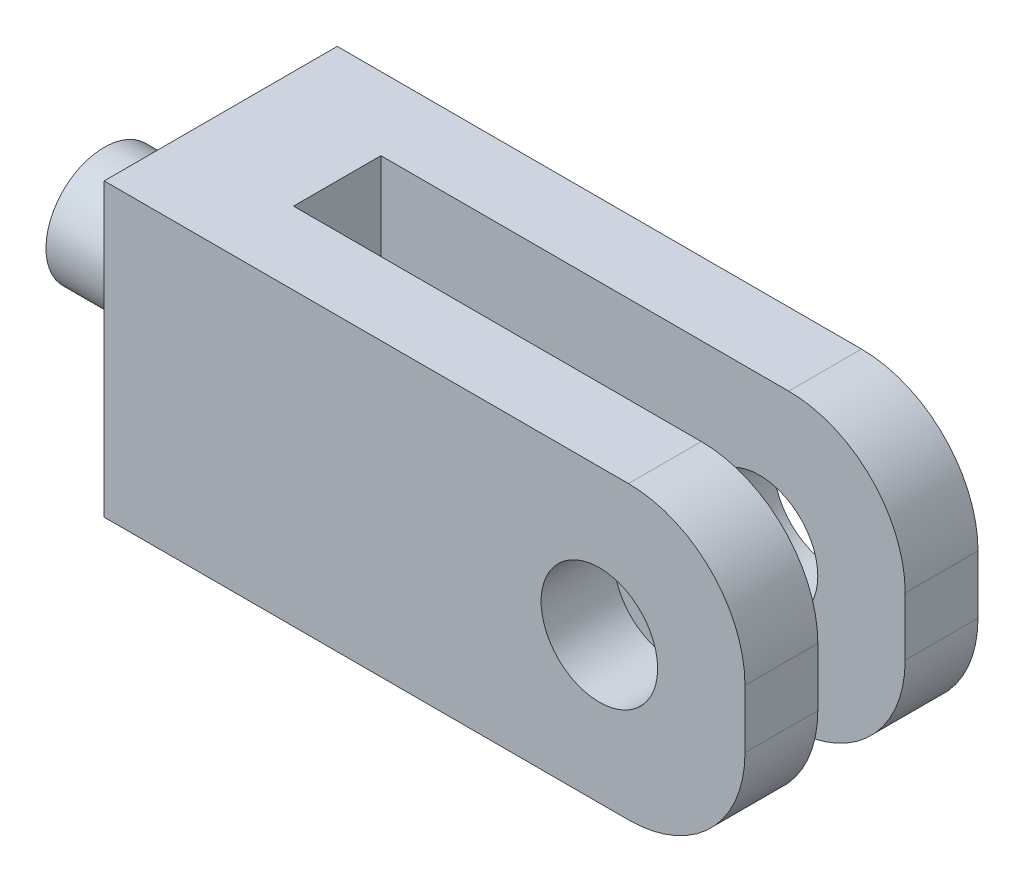
ISO-10303-21;
HEADER;
FILE_DESCRIPTION(('STEP AP214'),'2;1');
FILE_NAME('part.step','',(''),(''),'','','');
FILE_SCHEMA(('AUTOMOTIVE_DESIGN { 1 0 10303 214 1 1 1 1 }'));
ENDSEC;
DATA;
#1=APPLICATION_CONTEXT('core data for automotive mechanical design processes');
#2=APPLICATION_PROTOCOL_DEFINITION('international standard','automotive_design',2000,#1);
#3=PRODUCT_CONTEXT('',#1,'mechanical');
#4=PRODUCT('Part','Part','',(#3));
#5=PRODUCT_RELATED_PRODUCT_CATEGORY('part','',(#4));
#6=PRODUCT_DEFINITION_FORMATION('','',#4);
#7=PRODUCT_DEFINITION_CONTEXT('part definition',#1,'design');
#8=PRODUCT_DEFINITION('design','',#6,#7);
#9=PRODUCT_DEFINITION_SHAPE('','',#8);
#10=(LENGTH_UNIT() NAMED_UNIT(*) SI_UNIT(.MILLI.,.METRE.));
#11=(NAMED_UNIT(*) PLANE_ANGLE_UNIT() SI_UNIT($,.RADIAN.));
#12=(NAMED_UNIT(*) SI_UNIT($,.STERADIAN.) SOLID_ANGLE_UNIT());
#13=UNCERTAINTY_MEASURE_WITH_UNIT(LENGTH_MEASURE(1.E-05),#10,'distance_accuracy_value','');
#14=(GEOMETRIC_REPRESENTATION_CONTEXT(3) GLOBAL_UNCERTAINTY_ASSIGNED_CONTEXT((#13)) GLOBAL_UNIT_ASSIGNED_CONTEXT((#10,
#11,#12)) REPRESENTATION_CONTEXT('',''));
#15=CARTESIAN_POINT('',(0.,0.,0.));
#16=DIRECTION('',(0.,0.,1.));
#17=DIRECTION('',(1.,0.,0.));
#18=AXIS2_PLACEMENT_3D('',#15,#16,#17);
#19=CARTESIAN_POINT('',(55.,25.,40.));
#20=DIRECTION('',(-1.,0.,0.));
#21=DIRECTION('',(0.,0.,1.));
#22=AXIS2_PLACEMENT_3D('',#19,#20,#21);
#23=PLANE('',#22);
#24=DIRECTION('',(0.,1.,0.));
#25=VECTOR('',#24,1.);
#26=CARTESIAN_POINT('',(55.,25.,40.));
#27=LINE('',#26,#25);
#28=CARTESIAN_POINT('',(55.,-5.,40.));
#29=VERTEX_POINT('',#28);
#30=CARTESIAN_POINT('',(55.,5.,40.));
#31=VERTEX_POINT('',#30);
#32=EDGE_CURVE('E156',#29,#31,#27,.T.);
#33=ORIENTED_EDGE('',*,*,#32,.F.);
#34=DIRECTION('',(0.,0.,-1.));
#35=VECTOR('',#34,1.);
#36=CARTESIAN_POINT('',(55.,-5.,40.));
#37=LINE('',#36,#35);
#38=CARTESIAN_POINT('',(55.,-5.,27.5));
#39=VERTEX_POINT('',#38);
#40=EDGE_CURVE('E202',#29,#39,#37,.T.);
#41=ORIENTED_EDGE('',*,*,#40,.T.);
#42=DIRECTION('',(0.,-1.,0.));
#43=VECTOR('',#42,1.);
#44=CARTESIAN_POINT('',(55.,-25.,27.5));
#45=LINE('',#44,#43);
#46=CARTESIAN_POINT('',(55.,5.,27.5));
#47=VERTEX_POINT('',#46);
#48=EDGE_CURVE('E224',#47,#39,#45,.T.);
#49=ORIENTED_EDGE('',*,*,#48,.F.);
#50=DIRECTION('',(0.,0.,-1.));
#51=VECTOR('',#50,1.);
#52=CARTESIAN_POINT('',(55.,5.,40.));
#53=LINE('',#52,#51);
#54=EDGE_CURVE('E49',#47,#31,#53,.F.);
#55=ORIENTED_EDGE('',*,*,#54,.T.);
#56=EDGE_LOOP('',(#33,#41,#49,#55));
#57=FACE_BOUND('',#56,.T.);
#58=ADVANCED_FACE('F32',(#57),#23,.F.);
#59=DIRECTION('',(0.,1.,0.));
#60=VECTOR('',#59,1.);
#61=CARTESIAN_POINT('',(55.,-25.,12.5));
#62=LINE('',#61,#60);
#63=CARTESIAN_POINT('',(55.,-5.,12.5));
#64=VERTEX_POINT('',#63);
#65=CARTESIAN_POINT('',(55.,5.,12.5));
#66=VERTEX_POINT('',#65);
#67=EDGE_CURVE('E226',#64,#66,#62,.T.);
#68=ORIENTED_EDGE('',*,*,#67,.F.);
#69=DIRECTION('',(0.,0.,-1.));
#70=VECTOR('',#69,1.);
#71=CARTESIAN_POINT('',(55.,-5.,40.));
#72=LINE('',#71,#70);
#73=CARTESIAN_POINT('',(55.,-5.,0.));
#74=VERTEX_POINT('',#73);
#75=EDGE_CURVE('E181',#64,#74,#72,.T.);
#76=ORIENTED_EDGE('',*,*,#75,.T.);
#77=DIRECTION('',(0.,1.,0.));
#78=VECTOR('',#77,1.);
#79=CARTESIAN_POINT('',(55.,25.,0.));
#80=LINE('',#79,#78);
#81=CARTESIAN_POINT('',(55.,5.,0.));
#82=VERTEX_POINT('',#81);
#83=EDGE_CURVE('E166',#74,#82,#80,.T.);
#84=ORIENTED_EDGE('',*,*,#83,.T.);
#85=DIRECTION('',(0.,0.,-1.));
#86=VECTOR('',#85,1.);
#87=CARTESIAN_POINT('',(55.,5.,40.));
#88=LINE('',#87,#86);
#89=EDGE_CURVE('E179',#82,#66,#88,.F.);
#90=ORIENTED_EDGE('',*,*,#89,.T.);
#91=EDGE_LOOP('',(#68,#76,#84,#90));
#92=FACE_BOUND('',#91,.T.);
#93=ADVANCED_FACE('F272',(#92),#23,.F.);
#94=CARTESIAN_POINT('',(-55.,25.,40.));
#95=DIRECTION('',(0.,-1.,0.));
#96=DIRECTION('',(0.,0.,-1.));
#97=AXIS2_PLACEMENT_3D('',#94,#95,#96);
#98=PLANE('',#97);
#99=DIRECTION('',(1.,0.,0.));
#100=VECTOR('',#99,1.);
#101=CARTESIAN_POINT('',(-35.,25.,12.5));
#102=LINE('',#101,#100);
#103=CARTESIAN_POINT('',(-35.,25.,12.5));
#104=VERTEX_POINT('',#103);
#105=CARTESIAN_POINT('',(35.,25.,12.5));
#106=VERTEX_POINT('',#105);
#107=EDGE_CURVE('E131',#104,#106,#102,.T.);
#108=ORIENTED_EDGE('',*,*,#107,.T.);
#109=DIRECTION('',(0.,0.,-1.));
#110=VECTOR('',#109,1.);
#111=CARTESIAN_POINT('',(35.,25.,40.));
#112=LINE('',#111,#110);
#113=CARTESIAN_POINT('',(35.,25.,0.));
#114=VERTEX_POINT('',#113);
#115=EDGE_CURVE('E198',#106,#114,#112,.T.);
#116=ORIENTED_EDGE('',*,*,#115,.T.);
#117=DIRECTION('',(-1.,0.,0.));
#118=VECTOR('',#117,1.);
#119=CARTESIAN_POINT('',(-55.,25.,0.));
#120=LINE('',#119,#118);
#121=CARTESIAN_POINT('',(-55.,25.,0.));
#122=VERTEX_POINT('',#121);
#123=EDGE_CURVE('E169',#114,#122,#120,.T.);
#124=ORIENTED_EDGE('',*,*,#123,.T.);
#125=DIRECTION('',(0.,0.,-1.));
#126=VECTOR('',#125,1.);
#127=CARTESIAN_POINT('',(-55.,25.,40.));
#128=LINE('',#127,#126);
#129=CARTESIAN_POINT('',(-55.,25.,40.));
#130=VERTEX_POINT('',#129);
#131=EDGE_CURVE('E176',#130,#122,#128,.T.);
#132=ORIENTED_EDGE('',*,*,#131,.F.);
#133=DIRECTION('',(-1.,0.,0.));
#134=VECTOR('',#133,1.);
#135=CARTESIAN_POINT('',(-55.,25.,40.));
#136=LINE('',#135,#134);
#137=CARTESIAN_POINT('',(35.,25.,40.));
#138=VERTEX_POINT('',#137);
#139=EDGE_CURVE('E158',#138,#130,#136,.T.);
#140=ORIENTED_EDGE('',*,*,#139,.F.);
#141=DIRECTION('',(0.,0.,-1.));
#142=VECTOR('',#141,1.);
#143=CARTESIAN_POINT('',(35.,25.,40.));
#144=LINE('',#143,#142);
#145=CARTESIAN_POINT('',(35.,25.,27.5));
#146=VERTEX_POINT('',#145);
#147=EDGE_CURVE('E195',#138,#146,#144,.T.);
#148=ORIENTED_EDGE('',*,*,#147,.T.);
#149=DIRECTION('',(1.,0.,0.));
#150=VECTOR('',#149,1.);
#151=CARTESIAN_POINT('',(-35.,25.,27.5));
#152=LINE('',#151,#150);
#153=CARTESIAN_POINT('',(-35.,25.,27.5));
#154=VERTEX_POINT('',#153);
#155=EDGE_CURVE('E151',#154,#146,#152,.T.);
#156=ORIENTED_EDGE('',*,*,#155,.F.);
#157=DIRECTION('',(0.,0.,1.));
#158=VECTOR('',#157,1.);
#159=CARTESIAN_POINT('',(-35.,25.,12.5));
#160=LINE('',#159,#158);
#161=EDGE_CURVE('E135',#104,#154,#160,.T.);
#162=ORIENTED_EDGE('',*,*,#161,.F.);
#163=EDGE_LOOP('',(#108,#116,#124,#132,#140,#148,#156,#162));
#164=FACE_BOUND('',#163,.T.);
#165=ADVANCED_FACE('F217',(#164),#98,.F.);
#166=CARTESIAN_POINT('',(-55.,25.,40.));
#167=DIRECTION('',(1.,0.,0.));
#168=DIRECTION('',(0.,1.,0.));
#169=AXIS2_PLACEMENT_3D('',#166,#167,#168);
#170=PLANE('',#169);
#171=CARTESIAN_POINT('',(-55.,0.,20.));
#172=DIRECTION('',(-1.,0.,0.));
#173=DIRECTION('',(0.,-1.,0.));
#174=AXIS2_PLACEMENT_3D('',#171,#172,#173);
#175=CIRCLE('',#174,10.);
#176=CARTESIAN_POINT('',(-55.,-10.,20.));
#177=VERTEX_POINT('',#176);
#178=EDGE_CURVE('E11',#177,#177,#175,.T.);
#179=ORIENTED_EDGE('',*,*,#178,.F.);
#180=EDGE_LOOP('',(#179));
#181=FACE_BOUND('',#180,.T.);
#182=DIRECTION('',(0.,-1.,0.));
#183=VECTOR('',#182,1.);
#184=CARTESIAN_POINT('',(-55.,25.,0.));
#185=LINE('',#184,#183);
#186=CARTESIAN_POINT('',(-55.,-25.,0.));
#187=VERTEX_POINT('',#186);
#188=EDGE_CURVE('E171',#122,#187,#185,.T.);
#189=ORIENTED_EDGE('',*,*,#188,.T.);
#190=DIRECTION('',(0.,0.,-1.));
#191=VECTOR('',#190,1.);
#192=CARTESIAN_POINT('',(-55.,-25.,40.));
#193=LINE('',#192,#191);
#194=CARTESIAN_POINT('',(-55.,-25.,40.));
#195=VERTEX_POINT('',#194);
#196=EDGE_CURVE('E165',#195,#187,#193,.T.);
#197=ORIENTED_EDGE('',*,*,#196,.F.);
#198=DIRECTION('',(0.,-1.,0.));
#199=VECTOR('',#198,1.);
#200=CARTESIAN_POINT('',(-55.,25.,40.));
#201=LINE('',#200,#199);
#202=EDGE_CURVE('E161',#130,#195,#201,.T.);
#203=ORIENTED_EDGE('',*,*,#202,.F.);
#204=ORIENTED_EDGE('',*,*,#131,.T.);
#205=EDGE_LOOP('',(#189,#197,#203,#204));
#206=FACE_BOUND('',#205,.T.);
#207=ADVANCED_FACE('F255',(#181,#206),#170,.F.);
#208=CARTESIAN_POINT('',(-55.,-25.,40.));
#209=DIRECTION('',(0.,1.,0.));
#210=DIRECTION('',(0.,0.,1.));
#211=AXIS2_PLACEMENT_3D('',#208,#209,#210);
#212=PLANE('',#211);
#213=DIRECTION('',(1.,0.,0.));
#214=VECTOR('',#213,1.);
#215=CARTESIAN_POINT('',(-55.,-25.,0.));
#216=LINE('',#215,#214);
#217=CARTESIAN_POINT('',(35.,-25.,0.));
#218=VERTEX_POINT('',#217);
#219=EDGE_CURVE('E159',#187,#218,#216,.T.);
#220=ORIENTED_EDGE('',*,*,#219,.T.);
#221=DIRECTION('',(0.,0.,-1.));
#222=VECTOR('',#221,1.);
#223=CARTESIAN_POINT('',(35.,-25.,40.));
#224=LINE('',#223,#222);
#225=CARTESIAN_POINT('',(35.,-25.,12.5));
#226=VERTEX_POINT('',#225);
#227=EDGE_CURVE('E148',#218,#226,#224,.F.);
#228=ORIENTED_EDGE('',*,*,#227,.T.);
#229=DIRECTION('',(1.,0.,0.));
#230=VECTOR('',#229,1.);
#231=CARTESIAN_POINT('',(-35.,-25.,12.5));
#232=LINE('',#231,#230);
#233=CARTESIAN_POINT('',(-35.,-25.,12.5));
#234=VERTEX_POINT('',#233);
#235=EDGE_CURVE('E128',#234,#226,#232,.T.);
#236=ORIENTED_EDGE('',*,*,#235,.F.);
#237=DIRECTION('',(0.,0.,-1.));
#238=VECTOR('',#237,1.);
#239=CARTESIAN_POINT('',(-35.,-25.,12.5));
#240=LINE('',#239,#238);
#241=CARTESIAN_POINT('',(-35.,-25.,27.5));
#242=VERTEX_POINT('',#241);
#243=EDGE_CURVE('E136',#242,#234,#240,.T.);
#244=ORIENTED_EDGE('',*,*,#243,.F.);
#245=DIRECTION('',(1.,0.,0.));
#246=VECTOR('',#245,1.);
#247=CARTESIAN_POINT('',(-35.,-25.,27.5));
#248=LINE('',#247,#246);
#249=CARTESIAN_POINT('',(35.,-25.,27.5));
#250=VERTEX_POINT('',#249);
#251=EDGE_CURVE('E149',#242,#250,#248,.T.);
#252=ORIENTED_EDGE('',*,*,#251,.T.);
#253=DIRECTION('',(0.,0.,-1.));
#254=VECTOR('',#253,1.);
#255=CARTESIAN_POINT('',(35.,-25.,40.));
#256=LINE('',#255,#254);
#257=CARTESIAN_POINT('',(35.,-25.,40.));
#258=VERTEX_POINT('',#257);
#259=EDGE_CURVE('E188',#250,#258,#256,.F.);
#260=ORIENTED_EDGE('',*,*,#259,.T.);
#261=DIRECTION('',(1.,0.,0.));
#262=VECTOR('',#261,1.);
#263=CARTESIAN_POINT('',(-55.,-25.,40.));
#264=LINE('',#263,#262);
#265=EDGE_CURVE('E163',#195,#258,#264,.T.);
#266=ORIENTED_EDGE('',*,*,#265,.F.);
#267=ORIENTED_EDGE('',*,*,#196,.T.);
#268=EDGE_LOOP('',(#220,#228,#236,#244,#252,#260,#266,#267));
#269=FACE_BOUND('',#268,.T.);
#270=ADVANCED_FACE('F146',(#269),#212,.F.);
#271=CARTESIAN_POINT('',(0.,0.,40.));
#272=DIRECTION('',(0.,0.,1.));
#273=DIRECTION('',(1.,0.,0.));
#274=AXIS2_PLACEMENT_3D('',#271,#272,#273);
#275=PLANE('',#274);
#276=CARTESIAN_POINT('',(30.,0.,40.));
#277=DIRECTION('',(0.,0.,1.));
#278=DIRECTION('',(1.,0.,0.));
#279=AXIS2_PLACEMENT_3D('',#276,#277,#278);
#280=CIRCLE('',#279,10.);
#281=CARTESIAN_POINT('',(40.,0.,40.));
#282=VERTEX_POINT('',#281);
#283=EDGE_CURVE('E236',#282,#282,#280,.T.);
#284=ORIENTED_EDGE('',*,*,#283,.F.);
#285=EDGE_LOOP('',(#284));
#286=FACE_BOUND('',#285,.T.);
#287=ORIENTED_EDGE('',*,*,#265,.T.);
#288=CARTESIAN_POINT('',(35.,-5.,40.));
#289=DIRECTION('',(0.,0.,1.));
#290=DIRECTION('',(1.,0.,0.));
#291=AXIS2_PLACEMENT_3D('',#288,#289,#290);
#292=CIRCLE('',#291,20.);
#293=EDGE_CURVE('E41',#258,#29,#292,.T.);
#294=ORIENTED_EDGE('',*,*,#293,.T.);
#295=ORIENTED_EDGE('',*,*,#32,.T.);
#296=CARTESIAN_POINT('',(35.,5.,40.));
#297=DIRECTION('',(0.,0.,1.));
#298=DIRECTION('',(1.,0.,0.));
#299=AXIS2_PLACEMENT_3D('',#296,#297,#298);
#300=CIRCLE('',#299,20.);
#301=EDGE_CURVE('E209',#31,#138,#300,.T.);
#302=ORIENTED_EDGE('',*,*,#301,.T.);
#303=ORIENTED_EDGE('',*,*,#139,.T.);
#304=ORIENTED_EDGE('',*,*,#202,.T.);
#305=EDGE_LOOP('',(#287,#294,#295,#302,#303,#304));
#306=FACE_BOUND('',#305,.T.);
#307=ADVANCED_FACE('F212',(#286,#306),#275,.T.);
#308=CARTESIAN_POINT('',(0.,0.,0.));
#309=DIRECTION('',(0.,0.,1.));
#310=DIRECTION('',(1.,0.,0.));
#311=AXIS2_PLACEMENT_3D('',#308,#309,#310);
#312=PLANE('',#311);
#313=CARTESIAN_POINT('',(30.,0.,0.));
#314=DIRECTION('',(0.,0.,1.));
#315=DIRECTION('',(1.,0.,0.));
#316=AXIS2_PLACEMENT_3D('',#313,#314,#315);
#317=CIRCLE('',#316,10.);
#318=CARTESIAN_POINT('',(40.,0.,0.));
#319=VERTEX_POINT('',#318);
#320=EDGE_CURVE('E239',#319,#319,#317,.T.);
#321=ORIENTED_EDGE('',*,*,#320,.T.);
#322=EDGE_LOOP('',(#321));
#323=FACE_BOUND('',#322,.T.);
#324=ORIENTED_EDGE('',*,*,#83,.F.);
#325=CARTESIAN_POINT('',(35.,-5.,0.));
#326=DIRECTION('',(0.,0.,1.));
#327=DIRECTION('',(1.,0.,0.));
#328=AXIS2_PLACEMENT_3D('',#325,#326,#327);
#329=CIRCLE('',#328,20.);
#330=EDGE_CURVE('E186',#74,#218,#329,.F.);
#331=ORIENTED_EDGE('',*,*,#330,.T.);
#332=ORIENTED_EDGE('',*,*,#219,.F.);
#333=ORIENTED_EDGE('',*,*,#188,.F.);
#334=ORIENTED_EDGE('',*,*,#123,.F.);
#335=CARTESIAN_POINT('',(35.,5.,0.));
#336=DIRECTION('',(0.,0.,1.));
#337=DIRECTION('',(1.,0.,0.));
#338=AXIS2_PLACEMENT_3D('',#335,#336,#337);
#339=CIRCLE('',#338,20.);
#340=EDGE_CURVE('E184',#114,#82,#339,.F.);
#341=ORIENTED_EDGE('',*,*,#340,.T.);
#342=EDGE_LOOP('',(#324,#331,#332,#333,#334,#341));
#343=FACE_BOUND('',#342,.T.);
#344=ADVANCED_FACE('F266',(#323,#343),#312,.F.);
#345=CARTESIAN_POINT('',(-35.,-25.,27.5));
#346=DIRECTION('',(0.,0.,1.));
#347=DIRECTION('',(1.,0.,0.));
#348=AXIS2_PLACEMENT_3D('',#345,#346,#347);
#349=PLANE('',#348);
#350=CARTESIAN_POINT('',(30.,0.,27.5));
#351=DIRECTION('',(0.,0.,1.));
#352=DIRECTION('',(1.,0.,0.));
#353=AXIS2_PLACEMENT_3D('',#350,#351,#352);
#354=CIRCLE('',#353,10.);
#355=CARTESIAN_POINT('',(40.,0.,27.5));
#356=VERTEX_POINT('',#355);
#357=EDGE_CURVE('E227',#356,#356,#354,.T.);
#358=ORIENTED_EDGE('',*,*,#357,.T.);
#359=EDGE_LOOP('',(#358));
#360=FACE_BOUND('',#359,.T.);
#361=ORIENTED_EDGE('',*,*,#48,.T.);
#362=CARTESIAN_POINT('',(35.,-5.,27.5));
#363=DIRECTION('',(0.,0.,1.));
#364=DIRECTION('',(1.,0.,0.));
#365=AXIS2_PLACEMENT_3D('',#362,#363,#364);
#366=CIRCLE('',#365,20.);
#367=EDGE_CURVE('E207',#39,#250,#366,.F.);
#368=ORIENTED_EDGE('',*,*,#367,.T.);
#369=ORIENTED_EDGE('',*,*,#251,.F.);
#370=DIRECTION('',(0.,-1.,0.));
#371=VECTOR('',#370,1.);
#372=CARTESIAN_POINT('',(-35.,-25.,27.5));
#373=LINE('',#372,#371);
#374=EDGE_CURVE('E140',#154,#242,#373,.T.);
#375=ORIENTED_EDGE('',*,*,#374,.F.);
#376=ORIENTED_EDGE('',*,*,#155,.T.);
#377=CARTESIAN_POINT('',(35.,5.,27.5));
#378=DIRECTION('',(0.,0.,1.));
#379=DIRECTION('',(1.,0.,0.));
#380=AXIS2_PLACEMENT_3D('',#377,#378,#379);
#381=CIRCLE('',#380,20.);
#382=EDGE_CURVE('E205',#146,#47,#381,.F.);
#383=ORIENTED_EDGE('',*,*,#382,.T.);
#384=EDGE_LOOP('',(#361,#368,#369,#375,#376,#383));
#385=FACE_BOUND('',#384,.T.);
#386=ADVANCED_FACE('F223',(#360,#385),#349,.F.);
#387=CARTESIAN_POINT('',(-35.,-25.,12.5));
#388=DIRECTION('',(0.,0.,-1.));
#389=DIRECTION('',(-1.,0.,0.));
#390=AXIS2_PLACEMENT_3D('',#387,#388,#389);
#391=PLANE('',#390);
#392=CARTESIAN_POINT('',(30.,0.,12.5));
#393=DIRECTION('',(0.,0.,-1.));
#394=DIRECTION('',(-1.,0.,0.));
#395=AXIS2_PLACEMENT_3D('',#392,#393,#394);
#396=CIRCLE('',#395,10.);
#397=CARTESIAN_POINT('',(20.,0.,12.5));
#398=VERTEX_POINT('',#397);
#399=EDGE_CURVE('E36',#398,#398,#396,.T.);
#400=ORIENTED_EDGE('',*,*,#399,.T.);
#401=EDGE_LOOP('',(#400));
#402=FACE_BOUND('',#401,.T.);
#403=ORIENTED_EDGE('',*,*,#235,.T.);
#404=CARTESIAN_POINT('',(35.,-5.,12.5));
#405=DIRECTION('',(0.,0.,-1.));
#406=DIRECTION('',(-1.,0.,0.));
#407=AXIS2_PLACEMENT_3D('',#404,#405,#406);
#408=CIRCLE('',#407,20.);
#409=EDGE_CURVE('E193',#226,#64,#408,.F.);
#410=ORIENTED_EDGE('',*,*,#409,.T.);
#411=ORIENTED_EDGE('',*,*,#67,.T.);
#412=CARTESIAN_POINT('',(35.,5.,12.5));
#413=DIRECTION('',(0.,0.,-1.));
#414=DIRECTION('',(-1.,0.,0.));
#415=AXIS2_PLACEMENT_3D('',#412,#413,#414);
#416=CIRCLE('',#415,20.);
#417=EDGE_CURVE('E191',#66,#106,#416,.F.);
#418=ORIENTED_EDGE('',*,*,#417,.T.);
#419=ORIENTED_EDGE('',*,*,#107,.F.);
#420=DIRECTION('',(0.,1.,0.));
#421=VECTOR('',#420,1.);
#422=CARTESIAN_POINT('',(-35.,-25.,12.5));
#423=LINE('',#422,#421);
#424=EDGE_CURVE('E124',#234,#104,#423,.T.);
#425=ORIENTED_EDGE('',*,*,#424,.F.);
#426=EDGE_LOOP('',(#403,#410,#411,#418,#419,#425));
#427=FACE_BOUND('',#426,.T.);
#428=ADVANCED_FACE('F126',(#402,#427),#391,.F.);
#429=CARTESIAN_POINT('',(-35.,0.,0.));
#430=DIRECTION('',(1.,0.,0.));
#431=DIRECTION('',(0.,0.,-1.));
#432=AXIS2_PLACEMENT_3D('',#429,#430,#431);
#433=PLANE('',#432);
#434=ORIENTED_EDGE('',*,*,#374,.T.);
#435=ORIENTED_EDGE('',*,*,#243,.T.);
#436=ORIENTED_EDGE('',*,*,#424,.T.);
#437=ORIENTED_EDGE('',*,*,#161,.T.);
#438=EDGE_LOOP('',(#434,#435,#436,#437));
#439=FACE_BOUND('',#438,.T.);
#440=ADVANCED_FACE('F139',(#439),#433,.T.);
#441=CARTESIAN_POINT('',(35.,-5.,40.));
#442=DIRECTION('',(0.,0.,-1.));
#443=DIRECTION('',(-1.,0.,0.));
#444=AXIS2_PLACEMENT_3D('',#441,#442,#443);
#445=CYLINDRICAL_SURFACE('',#444,20.);
#446=ORIENTED_EDGE('',*,*,#409,.F.);
#447=ORIENTED_EDGE('',*,*,#227,.F.);
#448=ORIENTED_EDGE('',*,*,#330,.F.);
#449=ORIENTED_EDGE('',*,*,#75,.F.);
#450=EDGE_LOOP('',(#446,#447,#448,#449));
#451=FACE_BOUND('',#450,.T.);
#452=ADVANCED_FACE('F269',(#451),#445,.T.);
#453=CARTESIAN_POINT('',(35.,5.,40.));
#454=DIRECTION('',(0.,0.,-1.));
#455=DIRECTION('',(-1.,0.,0.));
#456=AXIS2_PLACEMENT_3D('',#453,#454,#455);
#457=CYLINDRICAL_SURFACE('',#456,20.);
#458=ORIENTED_EDGE('',*,*,#417,.F.);
#459=ORIENTED_EDGE('',*,*,#89,.F.);
#460=ORIENTED_EDGE('',*,*,#340,.F.);
#461=ORIENTED_EDGE('',*,*,#115,.F.);
#462=EDGE_LOOP('',(#458,#459,#460,#461));
#463=FACE_BOUND('',#462,.T.);
#464=ADVANCED_FACE('F277',(#463),#457,.T.);
#465=CARTESIAN_POINT('',(35.,-5.,40.));
#466=DIRECTION('',(0.,0.,-1.));
#467=DIRECTION('',(-1.,0.,0.));
#468=AXIS2_PLACEMENT_3D('',#465,#466,#467);
#469=CYLINDRICAL_SURFACE('',#468,20.);
#470=ORIENTED_EDGE('',*,*,#293,.F.);
#471=ORIENTED_EDGE('',*,*,#259,.F.);
#472=ORIENTED_EDGE('',*,*,#367,.F.);
#473=ORIENTED_EDGE('',*,*,#40,.F.);
#474=EDGE_LOOP('',(#470,#471,#472,#473));
#475=FACE_BOUND('',#474,.T.);
#476=ADVANCED_FACE('F279',(#475),#469,.T.);
#477=CARTESIAN_POINT('',(35.,5.,40.));
#478=DIRECTION('',(0.,0.,-1.));
#479=DIRECTION('',(-1.,0.,0.));
#480=AXIS2_PLACEMENT_3D('',#477,#478,#479);
#481=CYLINDRICAL_SURFACE('',#480,20.);
#482=ORIENTED_EDGE('',*,*,#301,.F.);
#483=ORIENTED_EDGE('',*,*,#54,.F.);
#484=ORIENTED_EDGE('',*,*,#382,.F.);
#485=ORIENTED_EDGE('',*,*,#147,.F.);
#486=EDGE_LOOP('',(#482,#483,#484,#485));
#487=FACE_BOUND('',#486,.T.);
#488=ADVANCED_FACE('F34',(#487),#481,.T.);
#489=CARTESIAN_POINT('',(30.,0.,0.));
#490=DIRECTION('',(0.,0.,1.));
#491=DIRECTION('',(1.,0.,0.));
#492=AXIS2_PLACEMENT_3D('',#489,#490,#491);
#493=CYLINDRICAL_SURFACE('',#492,10.);
#494=ORIENTED_EDGE('',*,*,#320,.F.);
#495=EDGE_LOOP('',(#494));
#496=FACE_BOUND('',#495,.T.);
#497=ORIENTED_EDGE('',*,*,#399,.F.);
#498=EDGE_LOOP('',(#497));
#499=FACE_BOUND('',#498,.T.);
#500=ADVANCED_FACE('F312',(#496,#499),#493,.F.);
#501=ORIENTED_EDGE('',*,*,#283,.T.);
#502=EDGE_LOOP('',(#501));
#503=FACE_BOUND('',#502,.T.);
#504=ORIENTED_EDGE('',*,*,#357,.F.);
#505=EDGE_LOOP('',(#504));
#506=FACE_BOUND('',#505,.T.);
#507=ADVANCED_FACE('F251',(#503,#506),#493,.F.);
#508=CARTESIAN_POINT('',(-75.,0.,20.));
#509=DIRECTION('',(1.,0.,0.));
#510=DIRECTION('',(0.,1.,0.));
#511=AXIS2_PLACEMENT_3D('',#508,#509,#510);
#512=CYLINDRICAL_SURFACE('',#511,10.);
#513=CARTESIAN_POINT('',(-75.,0.,20.));
#514=DIRECTION('',(-1.,0.,0.));
#515=DIRECTION('',(0.,-1.,0.));
#516=AXIS2_PLACEMENT_3D('',#513,#514,#515);
#517=CIRCLE('',#516,10.);
#518=CARTESIAN_POINT('',(-75.,-10.,20.));
#519=VERTEX_POINT('',#518);
#520=EDGE_CURVE('E240',#519,#519,#517,.T.);
#521=ORIENTED_EDGE('',*,*,#520,.F.);
#522=EDGE_LOOP('',(#521));
#523=FACE_BOUND('',#522,.T.);
#524=ORIENTED_EDGE('',*,*,#178,.T.);
#525=EDGE_LOOP('',(#524));
#526=FACE_BOUND('',#525,.T.);
#527=ADVANCED_FACE('F248',(#523,#526),#512,.T.);
#528=CARTESIAN_POINT('',(-75.,0.,20.));
#529=DIRECTION('',(-1.,0.,0.));
#530=DIRECTION('',(0.,-1.,0.));
#531=AXIS2_PLACEMENT_3D('',#528,#529,#530);
#532=PLANE('',#531);
#533=ORIENTED_EDGE('',*,*,#520,.T.);
#534=EDGE_LOOP('',(#533));
#535=FACE_BOUND('',#534,.T.);
#536=ADVANCED_FACE('F246',(#535),#532,.T.);
#537=CLOSED_SHELL('',(#58,#93,#165,#207,#270,#307,#344,#386,#428,#440,#452,#464,#476,#488,#500,
#507,#527,#536));
#538=MANIFOLD_SOLID_BREP('B2',#537);
#539=ADVANCED_BREP_SHAPE_REPRESENTATION('',(#18,#538),#14);
#540=SHAPE_DEFINITION_REPRESENTATION(#9,#539);
ENDSEC;
END-ISO-10303-21;
